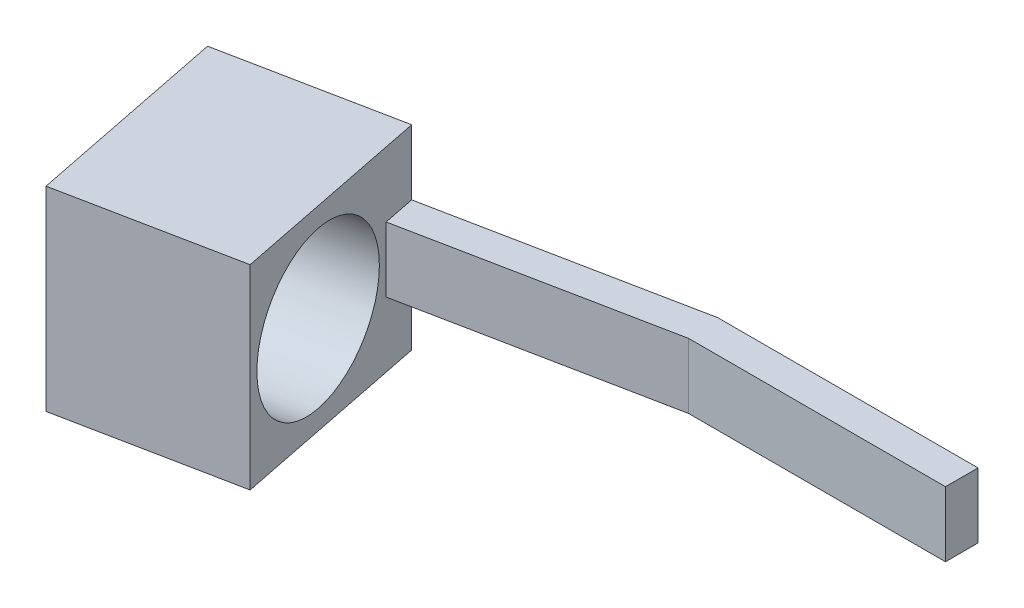
ISO-10303-21;
HEADER;
FILE_DESCRIPTION(('STEP AP214'),'2;1');
FILE_NAME('part.step','',(''),(''),'','','');
FILE_SCHEMA(('AUTOMOTIVE_DESIGN { 1 0 10303 214 1 1 1 1 }'));
ENDSEC;
DATA;
#1=APPLICATION_CONTEXT('core data for automotive mechanical design processes');
#2=APPLICATION_PROTOCOL_DEFINITION('international standard','automotive_design',2000,#1);
#3=PRODUCT_CONTEXT('',#1,'mechanical');
#4=PRODUCT('Part','Part','',(#3));
#5=PRODUCT_RELATED_PRODUCT_CATEGORY('part','',(#4));
#6=PRODUCT_DEFINITION_FORMATION('','',#4);
#7=PRODUCT_DEFINITION_CONTEXT('part definition',#1,'design');
#8=PRODUCT_DEFINITION('design','',#6,#7);
#9=PRODUCT_DEFINITION_SHAPE('','',#8);
#10=(LENGTH_UNIT() NAMED_UNIT(*) SI_UNIT(.MILLI.,.METRE.));
#11=(NAMED_UNIT(*) PLANE_ANGLE_UNIT() SI_UNIT($,.RADIAN.));
#12=(NAMED_UNIT(*) SI_UNIT($,.STERADIAN.) SOLID_ANGLE_UNIT());
#13=UNCERTAINTY_MEASURE_WITH_UNIT(LENGTH_MEASURE(1.E-05),#10,'distance_accuracy_value','');
#14=(GEOMETRIC_REPRESENTATION_CONTEXT(3) GLOBAL_UNCERTAINTY_ASSIGNED_CONTEXT((#13)) GLOBAL_UNIT_ASSIGNED_CONTEXT((#10,
#11,#12)) REPRESENTATION_CONTEXT('',''));
#15=CARTESIAN_POINT('',(0.,0.,0.));
#16=DIRECTION('',(0.,0.,1.));
#17=DIRECTION('',(1.,0.,0.));
#18=AXIS2_PLACEMENT_3D('',#15,#16,#17);
#19=CARTESIAN_POINT('',(0.,3.,0.));
#20=DIRECTION('',(0.,0.,-1.));
#21=DIRECTION('',(-1.,0.,0.));
#22=AXIS2_PLACEMENT_3D('',#19,#20,#21);
#23=PLANE('',#22);
#24=DIRECTION('',(1.,0.,0.));
#25=VECTOR('',#24,1.);
#26=CARTESIAN_POINT('',(0.,3.,0.));
#27=LINE('',#26,#25);
#28=CARTESIAN_POINT('',(0.148529270336033,3.,0.));
#29=VERTEX_POINT('',#28);
#30=CARTESIAN_POINT('',(12.,3.,0.));
#31=VERTEX_POINT('',#30);
#32=EDGE_CURVE('E51',#29,#31,#27,.T.);
#33=ORIENTED_EDGE('',*,*,#32,.F.);
#34=DIRECTION('',(0.,-1.,0.));
#35=VECTOR('',#34,1.);
#36=CARTESIAN_POINT('',(0.148529270336033,3.,0.));
#37=LINE('',#36,#35);
#38=CARTESIAN_POINT('',(0.148529270336033,0.,0.));
#39=VERTEX_POINT('',#38);
#40=EDGE_CURVE('E55',#29,#39,#37,.T.);
#41=ORIENTED_EDGE('',*,*,#40,.T.);
#42=DIRECTION('',(1.,0.,0.));
#43=VECTOR('',#42,1.);
#44=CARTESIAN_POINT('',(0.,0.,0.));
#45=LINE('',#44,#43);
#46=CARTESIAN_POINT('',(12.,0.,0.));
#47=VERTEX_POINT('',#46);
#48=EDGE_CURVE('E195',#39,#47,#45,.T.);
#49=ORIENTED_EDGE('',*,*,#48,.T.);
#50=DIRECTION('',(0.,-1.,0.));
#51=VECTOR('',#50,1.);
#52=CARTESIAN_POINT('',(12.,3.,0.));
#53=LINE('',#52,#51);
#54=EDGE_CURVE('E11',#31,#47,#53,.T.);
#55=ORIENTED_EDGE('',*,*,#54,.F.);
#56=EDGE_LOOP('',(#33,#41,#49,#55));
#57=FACE_BOUND('',#56,.T.);
#58=ADVANCED_FACE('F35',(#57),#23,.F.);
#59=CARTESIAN_POINT('',(12.,3.,0.));
#60=DIRECTION('',(-1.,0.,0.));
#61=DIRECTION('',(0.,0.,1.));
#62=AXIS2_PLACEMENT_3D('',#59,#60,#61);
#63=PLANE('',#62);
#64=DIRECTION('',(0.,0.,-1.));
#65=VECTOR('',#64,1.);
#66=CARTESIAN_POINT('',(12.,0.,0.));
#67=LINE('',#66,#65);
#68=CARTESIAN_POINT('',(12.,0.,-1.5));
#69=VERTEX_POINT('',#68);
#70=EDGE_CURVE('E203',#47,#69,#67,.T.);
#71=ORIENTED_EDGE('',*,*,#70,.T.);
#72=DIRECTION('',(0.,-1.,0.));
#73=VECTOR('',#72,1.);
#74=CARTESIAN_POINT('',(12.,3.,-1.5));
#75=LINE('',#74,#73);
#76=CARTESIAN_POINT('',(12.,3.,-1.5));
#77=VERTEX_POINT('',#76);
#78=EDGE_CURVE('E43',#77,#69,#75,.T.);
#79=ORIENTED_EDGE('',*,*,#78,.F.);
#80=DIRECTION('',(0.,0.,-1.));
#81=VECTOR('',#80,1.);
#82=CARTESIAN_POINT('',(12.,3.,0.));
#83=LINE('',#82,#81);
#84=EDGE_CURVE('E197',#31,#77,#83,.T.);
#85=ORIENTED_EDGE('',*,*,#84,.F.);
#86=ORIENTED_EDGE('',*,*,#54,.T.);
#87=EDGE_LOOP('',(#71,#79,#85,#86));
#88=FACE_BOUND('',#87,.T.);
#89=ADVANCED_FACE('F233',(#88),#63,.F.);
#90=CARTESIAN_POINT('',(12.,3.,-1.5));
#91=DIRECTION('',(0.,0.,1.));
#92=DIRECTION('',(1.,0.,0.));
#93=AXIS2_PLACEMENT_3D('',#90,#91,#92);
#94=PLANE('',#93);
#95=DIRECTION('',(-1.,0.,0.));
#96=VECTOR('',#95,1.);
#97=CARTESIAN_POINT('',(12.,0.,-1.5));
#98=LINE('',#97,#96);
#99=CARTESIAN_POINT('',(0.,0.,-1.5));
#100=VERTEX_POINT('',#99);
#101=EDGE_CURVE('E198',#69,#100,#98,.T.);
#102=ORIENTED_EDGE('',*,*,#101,.T.);
#103=DIRECTION('',(0.,-1.,0.));
#104=VECTOR('',#103,1.);
#105=CARTESIAN_POINT('',(0.,3.,-1.5));
#106=LINE('',#105,#104);
#107=CARTESIAN_POINT('',(0.,3.,-1.5));
#108=VERTEX_POINT('',#107);
#109=EDGE_CURVE('E177',#108,#100,#106,.T.);
#110=ORIENTED_EDGE('',*,*,#109,.F.);
#111=DIRECTION('',(-1.,0.,0.));
#112=VECTOR('',#111,1.);
#113=CARTESIAN_POINT('',(12.,3.,-1.5));
#114=LINE('',#113,#112);
#115=EDGE_CURVE('E200',#77,#108,#114,.T.);
#116=ORIENTED_EDGE('',*,*,#115,.F.);
#117=ORIENTED_EDGE('',*,*,#78,.T.);
#118=EDGE_LOOP('',(#102,#110,#116,#117));
#119=FACE_BOUND('',#118,.T.);
#120=ADVANCED_FACE('F239',(#119),#94,.F.);
#121=CARTESIAN_POINT('',(0.,3.,0.));
#122=DIRECTION('',(0.,1.,0.));
#123=DIRECTION('',(0.,0.,1.));
#124=AXIS2_PLACEMENT_3D('',#121,#122,#123);
#125=PLANE('',#124);
#126=ORIENTED_EDGE('',*,*,#115,.T.);
#127=DIRECTION('',(-0.980580675704682,0.,0.196116135069374));
#128=VECTOR('',#127,1.);
#129=CARTESIAN_POINT('',(0.,3.,-1.5));
#130=LINE('',#129,#128);
#131=CARTESIAN_POINT('',(-11.7669681084562,3.,0.853393620832493));
#132=VERTEX_POINT('',#131);
#133=EDGE_CURVE('E166',#108,#132,#130,.T.);
#134=ORIENTED_EDGE('',*,*,#133,.T.);
#135=DIRECTION('',(0.196116135069374,0.,0.980580675704682));
#136=VECTOR('',#135,1.);
#137=CARTESIAN_POINT('',(-11.7669681084562,3.,0.853393620832493));
#138=LINE('',#137,#136);
#139=CARTESIAN_POINT('',(-11.4727939058521,3.,2.32426463438952));
#140=VERTEX_POINT('',#139);
#141=EDGE_CURVE('E173',#132,#140,#138,.T.);
#142=ORIENTED_EDGE('',*,*,#141,.T.);
#143=DIRECTION('',(0.980580675704682,0.,-0.196116135069374));
#144=VECTOR('',#143,1.);
#145=CARTESIAN_POINT('',(-11.4727939058521,3.,2.32426463438952));
#146=LINE('',#145,#144);
#147=EDGE_CURVE('E180',#140,#29,#146,.T.);
#148=ORIENTED_EDGE('',*,*,#147,.T.);
#149=ORIENTED_EDGE('',*,*,#32,.T.);
#150=ORIENTED_EDGE('',*,*,#84,.T.);
#151=EDGE_LOOP('',(#126,#134,#142,#148,#149,#150));
#152=FACE_BOUND('',#151,.T.);
#153=ADVANCED_FACE('F243',(#152),#125,.T.);
#154=CARTESIAN_POINT('',(0.,0.,0.));
#155=DIRECTION('',(0.,1.,0.));
#156=DIRECTION('',(0.,0.,1.));
#157=AXIS2_PLACEMENT_3D('',#154,#155,#156);
#158=PLANE('',#157);
#159=DIRECTION('',(-0.980580675704682,0.,0.196116135069374));
#160=VECTOR('',#159,1.);
#161=CARTESIAN_POINT('',(0.,0.,-1.5));
#162=LINE('',#161,#160);
#163=CARTESIAN_POINT('',(-11.7669681084562,0.,0.853393620832493));
#164=VERTEX_POINT('',#163);
#165=EDGE_CURVE('E191',#100,#164,#162,.T.);
#166=ORIENTED_EDGE('',*,*,#165,.F.);
#167=ORIENTED_EDGE('',*,*,#101,.F.);
#168=ORIENTED_EDGE('',*,*,#70,.F.);
#169=ORIENTED_EDGE('',*,*,#48,.F.);
#170=DIRECTION('',(0.980580675704682,0.,-0.196116135069374));
#171=VECTOR('',#170,1.);
#172=CARTESIAN_POINT('',(-11.4727939058521,0.,2.32426463438952));
#173=LINE('',#172,#171);
#174=CARTESIAN_POINT('',(-11.4727939058521,0.,2.32426463438952));
#175=VERTEX_POINT('',#174);
#176=EDGE_CURVE('E188',#175,#39,#173,.T.);
#177=ORIENTED_EDGE('',*,*,#176,.F.);
#178=DIRECTION('',(0.196116135069374,0.,0.980580675704682));
#179=VECTOR('',#178,1.);
#180=CARTESIAN_POINT('',(-11.7669681084562,0.,0.853393620832493));
#181=LINE('',#180,#179);
#182=EDGE_CURVE('E209',#164,#175,#181,.T.);
#183=ORIENTED_EDGE('',*,*,#182,.F.);
#184=EDGE_LOOP('',(#166,#167,#168,#169,#177,#183));
#185=FACE_BOUND('',#184,.T.);
#186=ADVANCED_FACE('F247',(#185),#158,.F.);
#187=CARTESIAN_POINT('',(-11.4727939058521,0.,2.32426463438952));
#188=DIRECTION('',(0.196116135069374,0.,0.980580675704682));
#189=DIRECTION('',(0.980580675704682,0.,-0.196116135069374));
#190=AXIS2_PLACEMENT_3D('',#187,#188,#189);
#191=PLANE('',#190);
#192=ORIENTED_EDGE('',*,*,#40,.F.);
#193=ORIENTED_EDGE('',*,*,#147,.F.);
#194=DIRECTION('',(0.,1.,0.));
#195=VECTOR('',#194,1.);
#196=CARTESIAN_POINT('',(-11.4727939058521,0.,2.32426463438952));
#197=LINE('',#196,#195);
#198=EDGE_CURVE('E192',#175,#140,#197,.T.);
#199=ORIENTED_EDGE('',*,*,#198,.F.);
#200=ORIENTED_EDGE('',*,*,#176,.T.);
#201=EDGE_LOOP('',(#192,#193,#199,#200));
#202=FACE_BOUND('',#201,.T.);
#203=ADVANCED_FACE('F250',(#202),#191,.T.);
#204=CARTESIAN_POINT('',(0.,0.,-1.5));
#205=DIRECTION('',(-0.196116135069374,0.,-0.980580675704682));
#206=DIRECTION('',(-0.980580675704682,0.,0.196116135069374));
#207=AXIS2_PLACEMENT_3D('',#204,#205,#206);
#208=PLANE('',#207);
#209=ORIENTED_EDGE('',*,*,#133,.F.);
#210=ORIENTED_EDGE('',*,*,#109,.T.);
#211=ORIENTED_EDGE('',*,*,#165,.T.);
#212=DIRECTION('',(0.,1.,0.));
#213=VECTOR('',#212,1.);
#214=CARTESIAN_POINT('',(-11.7669681084562,-3.,0.853393620832493));
#215=LINE('',#214,#213);
#216=CARTESIAN_POINT('',(-11.7669681084562,-3.,0.853393620832493));
#217=VERTEX_POINT('',#216);
#218=EDGE_CURVE('E164',#217,#164,#215,.T.);
#219=ORIENTED_EDGE('',*,*,#218,.F.);
#220=DIRECTION('',(-0.980580675704682,0.,0.196116135069375));
#221=VECTOR('',#220,1.);
#222=CARTESIAN_POINT('',(-11.7669681084562,-3.,0.853393620832493));
#223=LINE('',#222,#221);
#224=CARTESIAN_POINT('',(-19.6116135140936,-3.,2.42232270138749));
#225=VERTEX_POINT('',#224);
#226=EDGE_CURVE('E119',#217,#225,#223,.T.);
#227=ORIENTED_EDGE('',*,*,#226,.T.);
#228=DIRECTION('',(0.,1.,0.));
#229=VECTOR('',#228,1.);
#230=CARTESIAN_POINT('',(-19.6116135140936,-3.,2.42232270138749));
#231=LINE('',#230,#229);
#232=CARTESIAN_POINT('',(-19.6116135140936,6.,2.42232270138749));
#233=VERTEX_POINT('',#232);
#234=EDGE_CURVE('E111',#225,#233,#231,.T.);
#235=ORIENTED_EDGE('',*,*,#234,.T.);
#236=DIRECTION('',(-0.980580675704682,0.,0.196116135069375));
#237=VECTOR('',#236,1.);
#238=CARTESIAN_POINT('',(-11.7669681084562,6.,0.853393620832493));
#239=LINE('',#238,#237);
#240=CARTESIAN_POINT('',(-11.7669681084562,6.,0.853393620832493));
#241=VERTEX_POINT('',#240);
#242=EDGE_CURVE('E117',#241,#233,#239,.T.);
#243=ORIENTED_EDGE('',*,*,#242,.F.);
#244=EDGE_CURVE('E161',#132,#241,#215,.T.);
#245=ORIENTED_EDGE('',*,*,#244,.F.);
#246=EDGE_LOOP('',(#209,#210,#211,#219,#227,#235,#243,#245));
#247=FACE_BOUND('',#246,.T.);
#248=ADVANCED_FACE('F114',(#247),#208,.T.);
#249=CARTESIAN_POINT('',(-11.7669681084562,-3.,0.853393620832493));
#250=DIRECTION('',(0.980580675704682,0.,-0.196116135069375));
#251=DIRECTION('',(-0.196116135069375,0.,-0.980580675704682));
#252=AXIS2_PLACEMENT_3D('',#249,#250,#251);
#253=PLANE('',#252);
#254=CARTESIAN_POINT('',(-10.6883293655746,1.5,6.24658733720825));
#255=DIRECTION('',(0.980580675704682,0.,-0.196116135069375));
#256=DIRECTION('',(-0.196116135069375,0.,-0.980580675704682));
#257=AXIS2_PLACEMENT_3D('',#254,#255,#256);
#258=CIRCLE('',#257,3.60000003899999);
#259=CARTESIAN_POINT('',(-11.3943474594729,1.5,2.71649686642875));
#260=VERTEX_POINT('',#259);
#261=EDGE_CURVE('E138',#260,#260,#258,.T.);
#262=ORIENTED_EDGE('',*,*,#261,.F.);
#263=EDGE_LOOP('',(#262));
#264=FACE_BOUND('',#263,.T.);
#265=ORIENTED_EDGE('',*,*,#141,.F.);
#266=ORIENTED_EDGE('',*,*,#244,.T.);
#267=DIRECTION('',(-0.196116135069375,0.,-0.980580675704682));
#268=VECTOR('',#267,1.);
#269=CARTESIAN_POINT('',(-11.7669681084562,6.,0.853393620832493));
#270=LINE('',#269,#268);
#271=CARTESIAN_POINT('',(-9.90386482529713,6.,10.168910040027));
#272=VERTEX_POINT('',#271);
#273=EDGE_CURVE('E137',#272,#241,#270,.T.);
#274=ORIENTED_EDGE('',*,*,#273,.F.);
#275=DIRECTION('',(0.,1.,0.));
#276=VECTOR('',#275,1.);
#277=CARTESIAN_POINT('',(-9.90386482529713,-3.,10.168910040027));
#278=LINE('',#277,#276);
#279=CARTESIAN_POINT('',(-9.90386482529713,-3.,10.168910040027));
#280=VERTEX_POINT('',#279);
#281=EDGE_CURVE('E157',#280,#272,#278,.T.);
#282=ORIENTED_EDGE('',*,*,#281,.F.);
#283=DIRECTION('',(-0.196116135069375,0.,-0.980580675704682));
#284=VECTOR('',#283,1.);
#285=CARTESIAN_POINT('',(-11.7669681084562,-3.,0.853393620832493));
#286=LINE('',#285,#284);
#287=EDGE_CURVE('E124',#280,#217,#286,.T.);
#288=ORIENTED_EDGE('',*,*,#287,.T.);
#289=ORIENTED_EDGE('',*,*,#218,.T.);
#290=ORIENTED_EDGE('',*,*,#182,.T.);
#291=ORIENTED_EDGE('',*,*,#198,.T.);
#292=EDGE_LOOP('',(#265,#266,#274,#282,#288,#289,#290,#291));
#293=FACE_BOUND('',#292,.T.);
#294=ADVANCED_FACE('F170',(#264,#293),#253,.T.);
#295=CARTESIAN_POINT('',(-9.90386482529713,-3.,10.168910040027));
#296=DIRECTION('',(0.196116135069375,0.,0.980580675704682));
#297=DIRECTION('',(0.980580675704682,0.,-0.196116135069375));
#298=AXIS2_PLACEMENT_3D('',#295,#296,#297);
#299=PLANE('',#298);
#300=ORIENTED_EDGE('',*,*,#281,.T.);
#301=DIRECTION('',(0.980580675704682,0.,-0.196116135069375));
#302=VECTOR('',#301,1.);
#303=CARTESIAN_POINT('',(-9.90386482529713,6.,10.168910040027));
#304=LINE('',#303,#302);
#305=CARTESIAN_POINT('',(-17.7485102309346,6.,11.737839120582));
#306=VERTEX_POINT('',#305);
#307=EDGE_CURVE('E132',#306,#272,#304,.T.);
#308=ORIENTED_EDGE('',*,*,#307,.F.);
#309=DIRECTION('',(0.,1.,0.));
#310=VECTOR('',#309,1.);
#311=CARTESIAN_POINT('',(-17.7485102309346,-3.,11.737839120582));
#312=LINE('',#311,#310);
#313=CARTESIAN_POINT('',(-17.7485102309346,-3.,11.737839120582));
#314=VERTEX_POINT('',#313);
#315=EDGE_CURVE('E123',#314,#306,#312,.T.);
#316=ORIENTED_EDGE('',*,*,#315,.F.);
#317=DIRECTION('',(0.980580675704682,0.,-0.196116135069375));
#318=VECTOR('',#317,1.);
#319=CARTESIAN_POINT('',(-9.90386482529713,-3.,10.168910040027));
#320=LINE('',#319,#318);
#321=EDGE_CURVE('E150',#314,#280,#320,.T.);
#322=ORIENTED_EDGE('',*,*,#321,.T.);
#323=EDGE_LOOP('',(#300,#308,#316,#322));
#324=FACE_BOUND('',#323,.T.);
#325=ADVANCED_FACE('F219',(#324),#299,.T.);
#326=CARTESIAN_POINT('',(-19.6116135140936,-3.,2.42232270138749));
#327=DIRECTION('',(-0.980580675704682,0.,0.196116135069374));
#328=DIRECTION('',(0.196116135069374,0.,0.980580675704682));
#329=AXIS2_PLACEMENT_3D('',#326,#327,#328);
#330=PLANE('',#329);
#331=CARTESIAN_POINT('',(-18.5329747712121,1.5,7.81551641776324));
#332=DIRECTION('',(-0.980580675704682,0.,0.196116135069374));
#333=DIRECTION('',(0.196116135069374,0.,0.980580675704682));
#334=AXIS2_PLACEMENT_3D('',#331,#332,#333);
#335=CIRCLE('',#334,3.600000039);
#336=CARTESIAN_POINT('',(-17.8269566773138,1.5,11.3456068885427));
#337=VERTEX_POINT('',#336);
#338=EDGE_CURVE('E141',#337,#337,#335,.T.);
#339=ORIENTED_EDGE('',*,*,#338,.F.);
#340=EDGE_LOOP('',(#339));
#341=FACE_BOUND('',#340,.T.);
#342=ORIENTED_EDGE('',*,*,#315,.T.);
#343=DIRECTION('',(0.196116135069374,0.,0.980580675704682));
#344=VECTOR('',#343,1.);
#345=CARTESIAN_POINT('',(-19.6116135140936,6.,2.42232270138749));
#346=LINE('',#345,#344);
#347=EDGE_CURVE('E127',#233,#306,#346,.T.);
#348=ORIENTED_EDGE('',*,*,#347,.F.);
#349=ORIENTED_EDGE('',*,*,#234,.F.);
#350=DIRECTION('',(0.196116135069374,0.,0.980580675704682));
#351=VECTOR('',#350,1.);
#352=CARTESIAN_POINT('',(-19.6116135140936,-3.,2.42232270138749));
#353=LINE('',#352,#351);
#354=EDGE_CURVE('E148',#225,#314,#353,.T.);
#355=ORIENTED_EDGE('',*,*,#354,.T.);
#356=EDGE_LOOP('',(#342,#348,#349,#355));
#357=FACE_BOUND('',#356,.T.);
#358=ADVANCED_FACE('F128',(#341,#357),#330,.T.);
#359=CARTESIAN_POINT('',(0.,-3.,0.));
#360=DIRECTION('',(0.,1.,0.));
#361=DIRECTION('',(0.,0.,1.));
#362=AXIS2_PLACEMENT_3D('',#359,#360,#361);
#363=PLANE('',#362);
#364=ORIENTED_EDGE('',*,*,#226,.F.);
#365=ORIENTED_EDGE('',*,*,#287,.F.);
#366=ORIENTED_EDGE('',*,*,#321,.F.);
#367=ORIENTED_EDGE('',*,*,#354,.F.);
#368=EDGE_LOOP('',(#364,#365,#366,#367));
#369=FACE_BOUND('',#368,.T.);
#370=ADVANCED_FACE('F218',(#369),#363,.F.);
#371=CARTESIAN_POINT('',(0.,6.,0.));
#372=DIRECTION('',(0.,1.,0.));
#373=DIRECTION('',(0.,0.,1.));
#374=AXIS2_PLACEMENT_3D('',#371,#372,#373);
#375=PLANE('',#374);
#376=ORIENTED_EDGE('',*,*,#242,.T.);
#377=ORIENTED_EDGE('',*,*,#347,.T.);
#378=ORIENTED_EDGE('',*,*,#307,.T.);
#379=ORIENTED_EDGE('',*,*,#273,.T.);
#380=EDGE_LOOP('',(#376,#377,#378,#379));
#381=FACE_BOUND('',#380,.T.);
#382=ADVANCED_FACE('F135',(#381),#375,.T.);
#383=CARTESIAN_POINT('',(-18.5329747712121,1.5,7.81551641776324));
#384=DIRECTION('',(-0.980580675704682,0.,0.196116135069374));
#385=DIRECTION('',(0.196116135069374,0.,0.980580675704682));
#386=AXIS2_PLACEMENT_3D('',#383,#384,#385);
#387=CYLINDRICAL_SURFACE('',#386,3.60000003899999);
#388=ORIENTED_EDGE('',*,*,#261,.T.);
#389=EDGE_LOOP('',(#388));
#390=FACE_BOUND('',#389,.T.);
#391=ORIENTED_EDGE('',*,*,#338,.T.);
#392=EDGE_LOOP('',(#391));
#393=FACE_BOUND('',#392,.T.);
#394=ADVANCED_FACE('F294',(#390,#393),#387,.F.);
#395=CLOSED_SHELL('',(#58,#89,#120,#153,#186,#203,#248,#294,#325,#358,#370,#382,#394));
#396=MANIFOLD_SOLID_BREP('B2',#395);
#397=ADVANCED_BREP_SHAPE_REPRESENTATION('',(#18,#396),#14);
#398=SHAPE_DEFINITION_REPRESENTATION(#9,#397);
ENDSEC;
END-ISO-10303-21;
